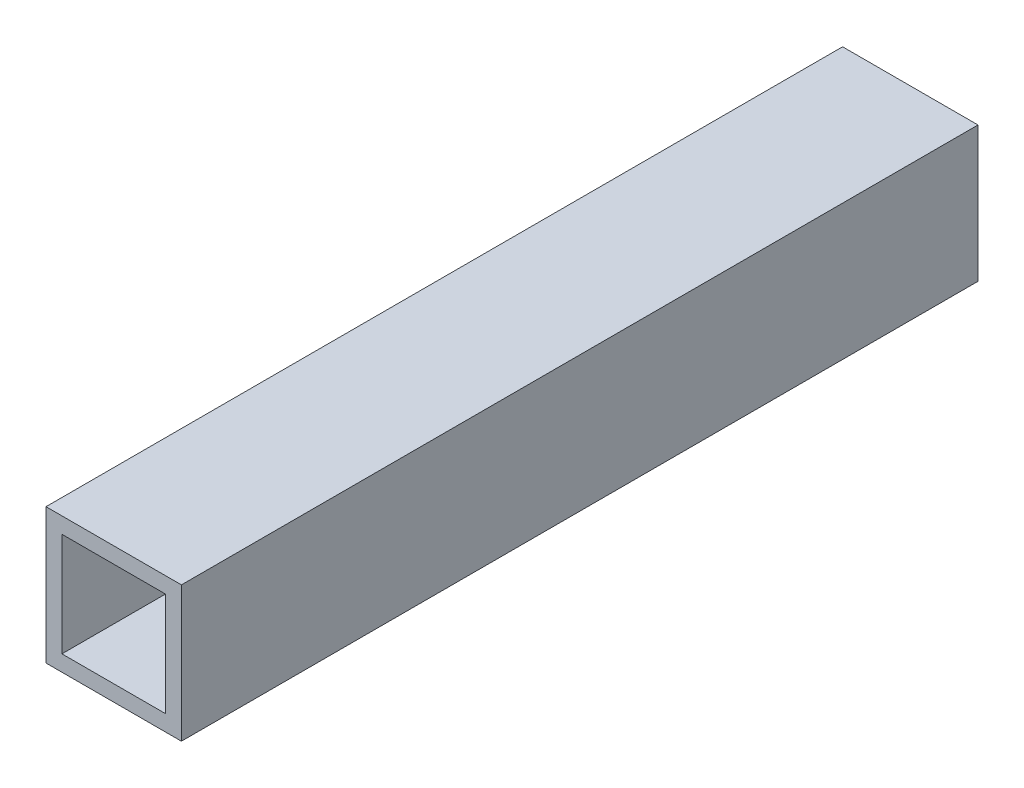
ISO-10303-21;
HEADER;
FILE_DESCRIPTION(('STEP AP214'),'2;1');
FILE_NAME('part.step','',(''),(''),'','','');
FILE_SCHEMA(('AUTOMOTIVE_DESIGN { 1 0 10303 214 1 1 1 1 }'));
ENDSEC;
DATA;
#1=APPLICATION_CONTEXT('core data for automotive mechanical design processes');
#2=APPLICATION_PROTOCOL_DEFINITION('international standard','automotive_design',2000,#1);
#3=PRODUCT_CONTEXT('',#1,'mechanical');
#4=PRODUCT('Part','Part','',(#3));
#5=PRODUCT_RELATED_PRODUCT_CATEGORY('part','',(#4));
#6=PRODUCT_DEFINITION_FORMATION('','',#4);
#7=PRODUCT_DEFINITION_CONTEXT('part definition',#1,'design');
#8=PRODUCT_DEFINITION('design','',#6,#7);
#9=PRODUCT_DEFINITION_SHAPE('','',#8);
#10=(LENGTH_UNIT() NAMED_UNIT(*) SI_UNIT(.MILLI.,.METRE.));
#11=(NAMED_UNIT(*) PLANE_ANGLE_UNIT() SI_UNIT($,.RADIAN.));
#12=(NAMED_UNIT(*) SI_UNIT($,.STERADIAN.) SOLID_ANGLE_UNIT());
#13=UNCERTAINTY_MEASURE_WITH_UNIT(LENGTH_MEASURE(1.E-05),#10,'distance_accuracy_value','');
#14=(GEOMETRIC_REPRESENTATION_CONTEXT(3) GLOBAL_UNCERTAINTY_ASSIGNED_CONTEXT((#13)) GLOBAL_UNIT_ASSIGNED_CONTEXT((#10,
#11,#12)) REPRESENTATION_CONTEXT('',''));
#15=CARTESIAN_POINT('',(0.,0.,0.));
#16=DIRECTION('',(0.,0.,1.));
#17=DIRECTION('',(1.,0.,0.));
#18=AXIS2_PLACEMENT_3D('',#15,#16,#17);
#19=CARTESIAN_POINT('',(0.,0.,100.));
#20=DIRECTION('',(0.,0.,-1.));
#21=DIRECTION('',(-1.,0.,0.));
#22=AXIS2_PLACEMENT_3D('',#19,#20,#21);
#23=PLANE('',#22);
#24=DIRECTION('',(0.,1.,0.));
#25=VECTOR('',#24,1.);
#26=CARTESIAN_POINT('',(8.5,-8.5,100.));
#27=LINE('',#26,#25);
#28=CARTESIAN_POINT('',(8.5,-8.5,100.));
#29=VERTEX_POINT('',#28);
#30=CARTESIAN_POINT('',(8.5,8.5,100.));
#31=VERTEX_POINT('',#30);
#32=EDGE_CURVE('E153',#29,#31,#27,.T.);
#33=ORIENTED_EDGE('',*,*,#32,.T.);
#34=DIRECTION('',(-1.,0.,0.));
#35=VECTOR('',#34,1.);
#36=CARTESIAN_POINT('',(-8.5,8.5,100.));
#37=LINE('',#36,#35);
#38=CARTESIAN_POINT('',(-8.5,8.5,100.));
#39=VERTEX_POINT('',#38);
#40=EDGE_CURVE('E157',#31,#39,#37,.T.);
#41=ORIENTED_EDGE('',*,*,#40,.T.);
#42=DIRECTION('',(0.,-1.,0.));
#43=VECTOR('',#42,1.);
#44=CARTESIAN_POINT('',(-8.5,-8.5,100.));
#45=LINE('',#44,#43);
#46=CARTESIAN_POINT('',(-8.5,-8.5,100.));
#47=VERTEX_POINT('',#46);
#48=EDGE_CURVE('E161',#39,#47,#45,.T.);
#49=ORIENTED_EDGE('',*,*,#48,.T.);
#50=DIRECTION('',(1.,0.,0.));
#51=VECTOR('',#50,1.);
#52=CARTESIAN_POINT('',(-8.5,-8.5,100.));
#53=LINE('',#52,#51);
#54=EDGE_CURVE('E164',#47,#29,#53,.T.);
#55=ORIENTED_EDGE('',*,*,#54,.T.);
#56=EDGE_LOOP('',(#33,#41,#49,#55));
#57=FACE_BOUND('',#56,.T.);
#58=DIRECTION('',(1.,0.,0.));
#59=VECTOR('',#58,1.);
#60=CARTESIAN_POINT('',(-6.5,-6.5,100.));
#61=LINE('',#60,#59);
#62=CARTESIAN_POINT('',(-6.5,-6.5,100.));
#63=VERTEX_POINT('',#62);
#64=CARTESIAN_POINT('',(6.5,-6.5,100.));
#65=VERTEX_POINT('',#64);
#66=EDGE_CURVE('E105',#63,#65,#61,.T.);
#67=ORIENTED_EDGE('',*,*,#66,.F.);
#68=DIRECTION('',(0.,-1.,0.));
#69=VECTOR('',#68,1.);
#70=CARTESIAN_POINT('',(-6.5,-6.5,100.));
#71=LINE('',#70,#69);
#72=CARTESIAN_POINT('',(-6.5,6.5,100.));
#73=VERTEX_POINT('',#72);
#74=EDGE_CURVE('E131',#73,#63,#71,.T.);
#75=ORIENTED_EDGE('',*,*,#74,.F.);
#76=DIRECTION('',(-1.,0.,0.));
#77=VECTOR('',#76,1.);
#78=CARTESIAN_POINT('',(-6.5,6.5,100.));
#79=LINE('',#78,#77);
#80=CARTESIAN_POINT('',(6.5,6.5,100.));
#81=VERTEX_POINT('',#80);
#82=EDGE_CURVE('E127',#81,#73,#79,.T.);
#83=ORIENTED_EDGE('',*,*,#82,.F.);
#84=DIRECTION('',(0.,1.,0.));
#85=VECTOR('',#84,1.);
#86=CARTESIAN_POINT('',(6.5,-6.5,100.));
#87=LINE('',#86,#85);
#88=EDGE_CURVE('E114',#65,#81,#87,.T.);
#89=ORIENTED_EDGE('',*,*,#88,.F.);
#90=EDGE_LOOP('',(#67,#75,#83,#89));
#91=FACE_BOUND('',#90,.T.);
#92=ADVANCED_FACE('F39',(#57,#91),#23,.F.);
#93=CARTESIAN_POINT('',(0.,0.,0.));
#94=DIRECTION('',(0.,0.,-1.));
#95=DIRECTION('',(-1.,0.,0.));
#96=AXIS2_PLACEMENT_3D('',#93,#94,#95);
#97=PLANE('',#96);
#98=DIRECTION('',(0.,1.,0.));
#99=VECTOR('',#98,1.);
#100=CARTESIAN_POINT('',(8.5,-8.5,0.));
#101=LINE('',#100,#99);
#102=CARTESIAN_POINT('',(8.5,-8.5,0.));
#103=VERTEX_POINT('',#102);
#104=CARTESIAN_POINT('',(8.5,8.5,0.));
#105=VERTEX_POINT('',#104);
#106=EDGE_CURVE('E123',#103,#105,#101,.T.);
#107=ORIENTED_EDGE('',*,*,#106,.F.);
#108=DIRECTION('',(1.,0.,0.));
#109=VECTOR('',#108,1.);
#110=CARTESIAN_POINT('',(-8.5,-8.5,0.));
#111=LINE('',#110,#109);
#112=CARTESIAN_POINT('',(-8.5,-8.5,0.));
#113=VERTEX_POINT('',#112);
#114=EDGE_CURVE('E158',#113,#103,#111,.T.);
#115=ORIENTED_EDGE('',*,*,#114,.F.);
#116=DIRECTION('',(0.,-1.,0.));
#117=VECTOR('',#116,1.);
#118=CARTESIAN_POINT('',(-8.5,-8.5,0.));
#119=LINE('',#118,#117);
#120=CARTESIAN_POINT('',(-8.5,8.5,0.));
#121=VERTEX_POINT('',#120);
#122=EDGE_CURVE('E174',#121,#113,#119,.T.);
#123=ORIENTED_EDGE('',*,*,#122,.F.);
#124=DIRECTION('',(-1.,0.,0.));
#125=VECTOR('',#124,1.);
#126=CARTESIAN_POINT('',(-8.5,8.5,0.));
#127=LINE('',#126,#125);
#128=EDGE_CURVE('E171',#105,#121,#127,.T.);
#129=ORIENTED_EDGE('',*,*,#128,.F.);
#130=EDGE_LOOP('',(#107,#115,#123,#129));
#131=FACE_BOUND('',#130,.T.);
#132=DIRECTION('',(0.,-1.,0.));
#133=VECTOR('',#132,1.);
#134=CARTESIAN_POINT('',(-6.5,-6.5,0.));
#135=LINE('',#134,#133);
#136=CARTESIAN_POINT('',(-6.5,6.5,0.));
#137=VERTEX_POINT('',#136);
#138=CARTESIAN_POINT('',(-6.5,-6.5,0.));
#139=VERTEX_POINT('',#138);
#140=EDGE_CURVE('E115',#137,#139,#135,.T.);
#141=ORIENTED_EDGE('',*,*,#140,.T.);
#142=DIRECTION('',(1.,0.,0.));
#143=VECTOR('',#142,1.);
#144=CARTESIAN_POINT('',(-6.5,-6.5,0.));
#145=LINE('',#144,#143);
#146=CARTESIAN_POINT('',(6.5,-6.5,0.));
#147=VERTEX_POINT('',#146);
#148=EDGE_CURVE('E63',#139,#147,#145,.T.);
#149=ORIENTED_EDGE('',*,*,#148,.T.);
#150=DIRECTION('',(0.,1.,0.));
#151=VECTOR('',#150,1.);
#152=CARTESIAN_POINT('',(6.5,-6.5,0.));
#153=LINE('',#152,#151);
#154=CARTESIAN_POINT('',(6.5,6.5,0.));
#155=VERTEX_POINT('',#154);
#156=EDGE_CURVE('E121',#147,#155,#153,.T.);
#157=ORIENTED_EDGE('',*,*,#156,.T.);
#158=DIRECTION('',(-1.,0.,0.));
#159=VECTOR('',#158,1.);
#160=CARTESIAN_POINT('',(-6.5,6.5,0.));
#161=LINE('',#160,#159);
#162=EDGE_CURVE('E140',#155,#137,#161,.T.);
#163=ORIENTED_EDGE('',*,*,#162,.T.);
#164=EDGE_LOOP('',(#141,#149,#157,#163));
#165=FACE_BOUND('',#164,.T.);
#166=ADVANCED_FACE('F197',(#131,#165),#97,.T.);
#167=CARTESIAN_POINT('',(8.5,-8.5,100.));
#168=DIRECTION('',(-1.,0.,0.));
#169=DIRECTION('',(0.,0.,1.));
#170=AXIS2_PLACEMENT_3D('',#167,#168,#169);
#171=PLANE('',#170);
#172=ORIENTED_EDGE('',*,*,#106,.T.);
#173=DIRECTION('',(0.,0.,-1.));
#174=VECTOR('',#173,1.);
#175=CARTESIAN_POINT('',(8.5,8.5,100.));
#176=LINE('',#175,#174);
#177=EDGE_CURVE('E11',#31,#105,#176,.T.);
#178=ORIENTED_EDGE('',*,*,#177,.F.);
#179=ORIENTED_EDGE('',*,*,#32,.F.);
#180=DIRECTION('',(0.,0.,-1.));
#181=VECTOR('',#180,1.);
#182=CARTESIAN_POINT('',(8.5,-8.5,100.));
#183=LINE('',#182,#181);
#184=EDGE_CURVE('E167',#29,#103,#183,.T.);
#185=ORIENTED_EDGE('',*,*,#184,.T.);
#186=EDGE_LOOP('',(#172,#178,#179,#185));
#187=FACE_BOUND('',#186,.T.);
#188=ADVANCED_FACE('F41',(#187),#171,.F.);
#189=CARTESIAN_POINT('',(-8.5,8.5,100.));
#190=DIRECTION('',(0.,-1.,0.));
#191=DIRECTION('',(0.,0.,-1.));
#192=AXIS2_PLACEMENT_3D('',#189,#190,#191);
#193=PLANE('',#192);
#194=ORIENTED_EDGE('',*,*,#128,.T.);
#195=DIRECTION('',(0.,0.,-1.));
#196=VECTOR('',#195,1.);
#197=CARTESIAN_POINT('',(-8.5,8.5,100.));
#198=LINE('',#197,#196);
#199=EDGE_CURVE('E48',#39,#121,#198,.T.);
#200=ORIENTED_EDGE('',*,*,#199,.F.);
#201=ORIENTED_EDGE('',*,*,#40,.F.);
#202=ORIENTED_EDGE('',*,*,#177,.T.);
#203=EDGE_LOOP('',(#194,#200,#201,#202));
#204=FACE_BOUND('',#203,.T.);
#205=ADVANCED_FACE('F207',(#204),#193,.F.);
#206=CARTESIAN_POINT('',(-8.5,-8.5,100.));
#207=DIRECTION('',(1.,0.,0.));
#208=DIRECTION('',(0.,0.,-1.));
#209=AXIS2_PLACEMENT_3D('',#206,#207,#208);
#210=PLANE('',#209);
#211=ORIENTED_EDGE('',*,*,#122,.T.);
#212=DIRECTION('',(0.,0.,-1.));
#213=VECTOR('',#212,1.);
#214=CARTESIAN_POINT('',(-8.5,-8.5,100.));
#215=LINE('',#214,#213);
#216=EDGE_CURVE('E182',#47,#113,#215,.T.);
#217=ORIENTED_EDGE('',*,*,#216,.F.);
#218=ORIENTED_EDGE('',*,*,#48,.F.);
#219=ORIENTED_EDGE('',*,*,#199,.T.);
#220=EDGE_LOOP('',(#211,#217,#218,#219));
#221=FACE_BOUND('',#220,.T.);
#222=ADVANCED_FACE('F191',(#221),#210,.F.);
#223=CARTESIAN_POINT('',(-8.5,-8.5,100.));
#224=DIRECTION('',(0.,1.,0.));
#225=DIRECTION('',(0.,0.,1.));
#226=AXIS2_PLACEMENT_3D('',#223,#224,#225);
#227=PLANE('',#226);
#228=ORIENTED_EDGE('',*,*,#114,.T.);
#229=ORIENTED_EDGE('',*,*,#184,.F.);
#230=ORIENTED_EDGE('',*,*,#54,.F.);
#231=ORIENTED_EDGE('',*,*,#216,.T.);
#232=EDGE_LOOP('',(#228,#229,#230,#231));
#233=FACE_BOUND('',#232,.T.);
#234=ADVANCED_FACE('F201',(#233),#227,.F.);
#235=CARTESIAN_POINT('',(-6.5,-6.5,100.));
#236=DIRECTION('',(0.,1.,0.));
#237=DIRECTION('',(0.,0.,1.));
#238=AXIS2_PLACEMENT_3D('',#235,#236,#237);
#239=PLANE('',#238);
#240=ORIENTED_EDGE('',*,*,#148,.F.);
#241=DIRECTION('',(0.,0.,-1.));
#242=VECTOR('',#241,1.);
#243=CARTESIAN_POINT('',(-6.5,-6.5,100.));
#244=LINE('',#243,#242);
#245=EDGE_CURVE('E109',#63,#139,#244,.T.);
#246=ORIENTED_EDGE('',*,*,#245,.F.);
#247=ORIENTED_EDGE('',*,*,#66,.T.);
#248=DIRECTION('',(0.,0.,-1.));
#249=VECTOR('',#248,1.);
#250=CARTESIAN_POINT('',(6.5,-6.5,100.));
#251=LINE('',#250,#249);
#252=EDGE_CURVE('E108',#65,#147,#251,.T.);
#253=ORIENTED_EDGE('',*,*,#252,.T.);
#254=EDGE_LOOP('',(#240,#246,#247,#253));
#255=FACE_BOUND('',#254,.T.);
#256=ADVANCED_FACE('F107',(#255),#239,.T.);
#257=CARTESIAN_POINT('',(6.5,-6.5,100.));
#258=DIRECTION('',(-1.,0.,0.));
#259=DIRECTION('',(0.,0.,1.));
#260=AXIS2_PLACEMENT_3D('',#257,#258,#259);
#261=PLANE('',#260);
#262=ORIENTED_EDGE('',*,*,#156,.F.);
#263=ORIENTED_EDGE('',*,*,#252,.F.);
#264=ORIENTED_EDGE('',*,*,#88,.T.);
#265=DIRECTION('',(0.,0.,-1.));
#266=VECTOR('',#265,1.);
#267=CARTESIAN_POINT('',(6.5,6.5,100.));
#268=LINE('',#267,#266);
#269=EDGE_CURVE('E124',#81,#155,#268,.T.);
#270=ORIENTED_EDGE('',*,*,#269,.T.);
#271=EDGE_LOOP('',(#262,#263,#264,#270));
#272=FACE_BOUND('',#271,.T.);
#273=ADVANCED_FACE('F118',(#272),#261,.T.);
#274=CARTESIAN_POINT('',(-6.5,6.5,100.));
#275=DIRECTION('',(0.,-1.,0.));
#276=DIRECTION('',(0.,0.,-1.));
#277=AXIS2_PLACEMENT_3D('',#274,#275,#276);
#278=PLANE('',#277);
#279=ORIENTED_EDGE('',*,*,#162,.F.);
#280=ORIENTED_EDGE('',*,*,#269,.F.);
#281=ORIENTED_EDGE('',*,*,#82,.T.);
#282=DIRECTION('',(0.,0.,-1.));
#283=VECTOR('',#282,1.);
#284=CARTESIAN_POINT('',(-6.5,6.5,100.));
#285=LINE('',#284,#283);
#286=EDGE_CURVE('E55',#73,#137,#285,.T.);
#287=ORIENTED_EDGE('',*,*,#286,.T.);
#288=EDGE_LOOP('',(#279,#280,#281,#287));
#289=FACE_BOUND('',#288,.T.);
#290=ADVANCED_FACE('F230',(#289),#278,.T.);
#291=CARTESIAN_POINT('',(-6.5,-6.5,100.));
#292=DIRECTION('',(1.,0.,0.));
#293=DIRECTION('',(0.,0.,-1.));
#294=AXIS2_PLACEMENT_3D('',#291,#292,#293);
#295=PLANE('',#294);
#296=ORIENTED_EDGE('',*,*,#140,.F.);
#297=ORIENTED_EDGE('',*,*,#286,.F.);
#298=ORIENTED_EDGE('',*,*,#74,.T.);
#299=ORIENTED_EDGE('',*,*,#245,.T.);
#300=EDGE_LOOP('',(#296,#297,#298,#299));
#301=FACE_BOUND('',#300,.T.);
#302=ADVANCED_FACE('F234',(#301),#295,.T.);
#303=CLOSED_SHELL('',(#92,#166,#188,#205,#222,#234,#256,#273,#290,#302));
#304=MANIFOLD_SOLID_BREP('B2',#303);
#305=ADVANCED_BREP_SHAPE_REPRESENTATION('',(#18,#304),#14);
#306=SHAPE_DEFINITION_REPRESENTATION(#9,#305);
ENDSEC;
END-ISO-10303-21;
